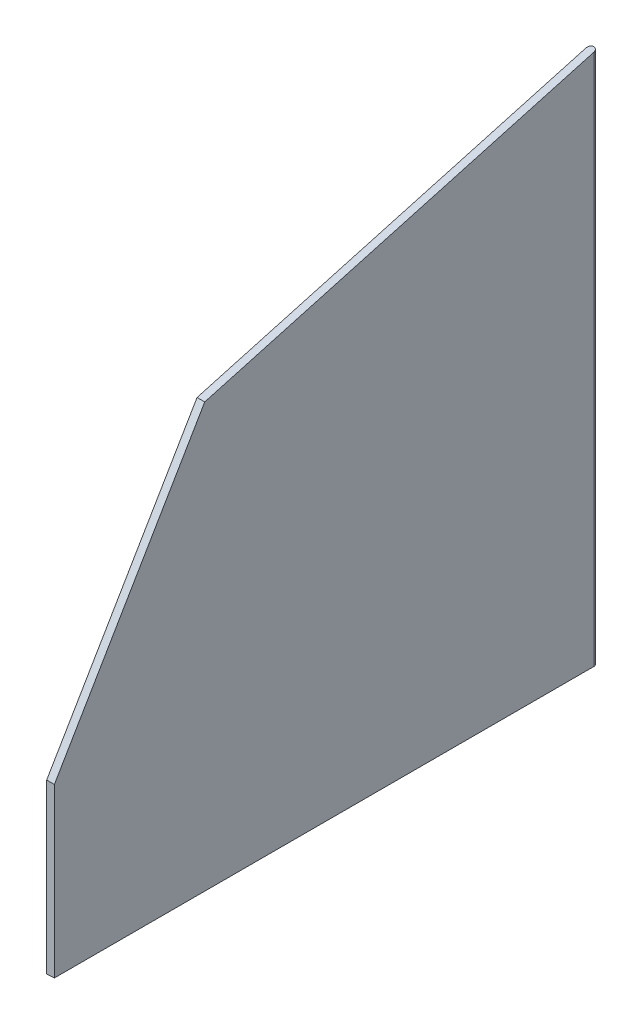
ISO-10303-21;
HEADER;
FILE_DESCRIPTION(('STEP AP214'),'2;1');
FILE_NAME('part.step','',(''),(''),'','','');
FILE_SCHEMA(('AUTOMOTIVE_DESIGN { 1 0 10303 214 1 1 1 1 }'));
ENDSEC;
DATA;
#1=APPLICATION_CONTEXT('core data for automotive mechanical design processes');
#2=APPLICATION_PROTOCOL_DEFINITION('international standard','automotive_design',2000,#1);
#3=PRODUCT_CONTEXT('',#1,'mechanical');
#4=PRODUCT('Part','Part','',(#3));
#5=PRODUCT_RELATED_PRODUCT_CATEGORY('part','',(#4));
#6=PRODUCT_DEFINITION_FORMATION('','',#4);
#7=PRODUCT_DEFINITION_CONTEXT('part definition',#1,'design');
#8=PRODUCT_DEFINITION('design','',#6,#7);
#9=PRODUCT_DEFINITION_SHAPE('','',#8);
#10=(LENGTH_UNIT() NAMED_UNIT(*) SI_UNIT(.MILLI.,.METRE.));
#11=(NAMED_UNIT(*) PLANE_ANGLE_UNIT() SI_UNIT($,.RADIAN.));
#12=(NAMED_UNIT(*) SI_UNIT($,.STERADIAN.) SOLID_ANGLE_UNIT());
#13=UNCERTAINTY_MEASURE_WITH_UNIT(LENGTH_MEASURE(1.E-05),#10,'distance_accuracy_value','');
#14=(GEOMETRIC_REPRESENTATION_CONTEXT(3) GLOBAL_UNCERTAINTY_ASSIGNED_CONTEXT((#13)) GLOBAL_UNIT_ASSIGNED_CONTEXT((#10,
#11,#12)) REPRESENTATION_CONTEXT('',''));
#15=CARTESIAN_POINT('',(0.,0.,0.));
#16=DIRECTION('',(0.,0.,1.));
#17=DIRECTION('',(1.,0.,0.));
#18=AXIS2_PLACEMENT_3D('',#15,#16,#17);
#19=CARTESIAN_POINT('',(20.,-136.254408060453,776.290409850645));
#20=DIRECTION('',(0.,0.,-1.));
#21=DIRECTION('',(0.,1.,0.));
#22=AXIS2_PLACEMENT_3D('',#19,#20,#21);
#23=PLANE('',#22);
#24=DIRECTION('',(-0.997789886117022,-0.0664480485987357,0.));
#25=VECTOR('',#24,1.);
#26=CARTESIAN_POINT('',(48.8853135355899,-569.998879281525,776.290409850645));
#27=LINE('',#26,#25);
#28=CARTESIAN_POINT('',(20.,-571.922503427559,776.290409850645));
#29=VERTEX_POINT('',#28);
#30=CARTESIAN_POINT('',(0.,-573.254408060453,776.290409850645));
#31=VERTEX_POINT('',#30);
#32=EDGE_CURVE('E94',#29,#31,#27,.T.);
#33=ORIENTED_EDGE('',*,*,#32,.F.);
#34=DIRECTION('',(0.,-1.,0.));
#35=VECTOR('',#34,1.);
#36=CARTESIAN_POINT('',(20.,-136.254408060453,776.290409850645));
#37=LINE('',#36,#35);
#38=CARTESIAN_POINT('',(20.,-136.254408060453,776.290409850645));
#39=VERTEX_POINT('',#38);
#40=EDGE_CURVE('E106',#39,#29,#37,.T.);
#41=ORIENTED_EDGE('',*,*,#40,.F.);
#42=DIRECTION('',(-1.,0.,0.));
#43=VECTOR('',#42,1.);
#44=CARTESIAN_POINT('',(20.,-136.254408060453,776.290409850645));
#45=LINE('',#44,#43);
#46=CARTESIAN_POINT('',(0.,-136.254408060453,776.290409850645));
#47=VERTEX_POINT('',#46);
#48=EDGE_CURVE('E113',#39,#47,#45,.T.);
#49=ORIENTED_EDGE('',*,*,#48,.T.);
#50=DIRECTION('',(0.,-1.,0.));
#51=VECTOR('',#50,1.);
#52=CARTESIAN_POINT('',(0.,-136.254408060453,776.290409850645));
#53=LINE('',#52,#51);
#54=EDGE_CURVE('E107',#47,#31,#53,.T.);
#55=ORIENTED_EDGE('',*,*,#54,.T.);
#56=EDGE_LOOP('',(#33,#41,#49,#55));
#57=FACE_BOUND('',#56,.T.);
#58=ADVANCED_FACE('F39',(#57),#23,.F.);
#59=CARTESIAN_POINT('',(20.,0.,0.));
#60=DIRECTION('',(-1.,0.,0.));
#61=DIRECTION('',(0.,0.,1.));
#62=AXIS2_PLACEMENT_3D('',#59,#60,#61);
#63=PLANE('',#62);
#64=DIRECTION('',(0.,0.,-1.));
#65=VECTOR('',#64,1.);
#66=CARTESIAN_POINT('',(20.,-571.922503427559,871.));
#67=LINE('',#66,#65);
#68=CARTESIAN_POINT('',(20.,-571.922503427559,-625.709590149355));
#69=VERTEX_POINT('',#68);
#70=EDGE_CURVE('E93',#29,#69,#67,.T.);
#71=ORIENTED_EDGE('',*,*,#70,.T.);
#72=DIRECTION('',(0.,1.,0.));
#73=VECTOR('',#72,1.);
#74=CARTESIAN_POINT('',(20.,0.,-625.709590149355));
#75=LINE('',#74,#73);
#76=CARTESIAN_POINT('',(20.,810.962210145606,-625.709590149355));
#77=VERTEX_POINT('',#76);
#78=EDGE_CURVE('E131',#69,#77,#75,.T.);
#79=ORIENTED_EDGE('',*,*,#78,.T.);
#80=DIRECTION('',(0.,-0.268145033201166,0.963378555485613));
#81=VECTOR('',#80,1.);
#82=CARTESIAN_POINT('',(20.,813.745591939547,-635.709590149355));
#83=LINE('',#82,#81);
#84=CARTESIAN_POINT('',(20.,529.511856746311,385.471678665395));
#85=VERTEX_POINT('',#84);
#86=EDGE_CURVE('E118',#77,#85,#83,.T.);
#87=ORIENTED_EDGE('',*,*,#86,.T.);
#88=DIRECTION('',(0.,-0.862391534723788,0.506241879773641));
#89=VECTOR('',#88,1.);
#90=CARTESIAN_POINT('',(20.,529.511856746311,385.471678665395));
#91=LINE('',#90,#89);
#92=EDGE_CURVE('E114',#85,#39,#91,.T.);
#93=ORIENTED_EDGE('',*,*,#92,.T.);
#94=ORIENTED_EDGE('',*,*,#40,.T.);
#95=EDGE_LOOP('',(#71,#79,#87,#93,#94));
#96=FACE_BOUND('',#95,.T.);
#97=ADVANCED_FACE('F112',(#96),#63,.F.);
#98=CARTESIAN_POINT('',(20.,813.745591939547,-635.709590149355));
#99=DIRECTION('',(0.,-0.963378555485613,-0.268145033201166));
#100=DIRECTION('',(0.,0.268145033201166,-0.963378555485613));
#101=AXIS2_PLACEMENT_3D('',#98,#99,#100);
#102=PLANE('',#101);
#103=ORIENTED_EDGE('',*,*,#86,.F.);
#104=CARTESIAN_POINT('',(10.,810.962210145606,-625.709590149355));
#105=DIRECTION('',(0.,-0.963378555485613,-0.268145033201166));
#106=DIRECTION('',(0.,0.268145033201166,-0.963378555485613));
#107=AXIS2_PLACEMENT_3D('',#104,#105,#106);
#108=ELLIPSE('',#107,10.3801355584039,10.);
#109=CARTESIAN_POINT('',(10.,813.745591939547,-635.709590149355));
#110=VERTEX_POINT('',#109);
#111=EDGE_CURVE('E134',#77,#110,#108,.F.);
#112=ORIENTED_EDGE('',*,*,#111,.T.);
#113=CARTESIAN_POINT('',(10.,810.962210145606,-625.709590149355));
#114=DIRECTION('',(0.,-0.963378555485613,-0.268145033201166));
#115=DIRECTION('',(0.,-0.268145033201166,0.963378555485613));
#116=AXIS2_PLACEMENT_3D('',#113,#114,#115);
#117=ELLIPSE('',#116,10.3801355584039,10.);
#118=CARTESIAN_POINT('',(0.,810.962210145606,-625.709590149355));
#119=VERTEX_POINT('',#118);
#120=EDGE_CURVE('E132',#110,#119,#117,.F.);
#121=ORIENTED_EDGE('',*,*,#120,.T.);
#122=DIRECTION('',(0.,-0.268145033201166,0.963378555485613));
#123=VECTOR('',#122,1.);
#124=CARTESIAN_POINT('',(0.,813.745591939547,-635.709590149355));
#125=LINE('',#124,#123);
#126=CARTESIAN_POINT('',(0.,529.511856746311,385.471678665395));
#127=VERTEX_POINT('',#126);
#128=EDGE_CURVE('E108',#119,#127,#125,.T.);
#129=ORIENTED_EDGE('',*,*,#128,.T.);
#130=DIRECTION('',(-1.,0.,0.));
#131=VECTOR('',#130,1.);
#132=CARTESIAN_POINT('',(20.,529.511856746311,385.471678665395));
#133=LINE('',#132,#131);
#134=EDGE_CURVE('E120',#85,#127,#133,.T.);
#135=ORIENTED_EDGE('',*,*,#134,.F.);
#136=EDGE_LOOP('',(#103,#112,#121,#129,#135));
#137=FACE_BOUND('',#136,.T.);
#138=ADVANCED_FACE('F143',(#137),#102,.F.);
#139=CARTESIAN_POINT('',(20.,529.511856746311,385.471678665395));
#140=DIRECTION('',(0.,-0.506241879773641,-0.862391534723788));
#141=DIRECTION('',(0.,0.862391534723788,-0.506241879773641));
#142=AXIS2_PLACEMENT_3D('',#139,#140,#141);
#143=PLANE('',#142);
#144=DIRECTION('',(0.,-0.862391534723788,0.506241879773641));
#145=VECTOR('',#144,1.);
#146=CARTESIAN_POINT('',(0.,529.511856746311,385.471678665395));
#147=LINE('',#146,#145);
#148=EDGE_CURVE('E122',#127,#47,#147,.T.);
#149=ORIENTED_EDGE('',*,*,#148,.T.);
#150=ORIENTED_EDGE('',*,*,#48,.F.);
#151=ORIENTED_EDGE('',*,*,#92,.F.);
#152=ORIENTED_EDGE('',*,*,#134,.T.);
#153=EDGE_LOOP('',(#149,#150,#151,#152));
#154=FACE_BOUND('',#153,.T.);
#155=ADVANCED_FACE('F156',(#154),#143,.F.);
#156=CARTESIAN_POINT('',(0.,0.,0.));
#157=DIRECTION('',(-1.,0.,0.));
#158=DIRECTION('',(0.,0.,1.));
#159=AXIS2_PLACEMENT_3D('',#156,#157,#158);
#160=PLANE('',#159);
#161=ORIENTED_EDGE('',*,*,#128,.F.);
#162=DIRECTION('',(0.,1.,0.));
#163=VECTOR('',#162,1.);
#164=CARTESIAN_POINT('',(0.,-573.254408060453,-625.709590149355));
#165=LINE('',#164,#163);
#166=CARTESIAN_POINT('',(0.,-573.254408060453,-625.709590149355));
#167=VERTEX_POINT('',#166);
#168=EDGE_CURVE('E11',#119,#167,#165,.F.);
#169=ORIENTED_EDGE('',*,*,#168,.T.);
#170=DIRECTION('',(0.,0.,-1.));
#171=VECTOR('',#170,1.);
#172=CARTESIAN_POINT('',(0.,-573.254408060453,776.290409850645));
#173=LINE('',#172,#171);
#174=EDGE_CURVE('E130',#31,#167,#173,.T.);
#175=ORIENTED_EDGE('',*,*,#174,.F.);
#176=ORIENTED_EDGE('',*,*,#54,.F.);
#177=ORIENTED_EDGE('',*,*,#148,.F.);
#178=EDGE_LOOP('',(#161,#169,#175,#176,#177));
#179=FACE_BOUND('',#178,.T.);
#180=ADVANCED_FACE('F160',(#179),#160,.T.);
#181=CARTESIAN_POINT('',(20.,-571.922503427559,871.));
#182=DIRECTION('',(0.0664480485987357,-0.997789886117022,0.));
#183=DIRECTION('',(0.997789886117022,0.0664480485987357,0.));
#184=AXIS2_PLACEMENT_3D('',#181,#182,#183);
#185=PLANE('',#184);
#186=CARTESIAN_POINT('',(10.0021453411074,-572.588312874518,-625.709590149355));
#187=DIRECTION('',(0.0664480485987357,-0.997789886117022,0.));
#188=DIRECTION('',(0.997789886117022,0.0664480485987357,0.));
#189=AXIS2_PLACEMENT_3D('',#186,#187,#188);
#190=CIRCLE('',#189,5.);
#191=CARTESIAN_POINT('',(14.9910947716925,-572.256072631524,-625.709590149355));
#192=VERTEX_POINT('',#191);
#193=EDGE_CURVE('E150',#192,#192,#190,.T.);
#194=ORIENTED_EDGE('',*,*,#193,.F.);
#195=EDGE_LOOP('',(#194));
#196=FACE_BOUND('',#195,.T.);
#197=CARTESIAN_POINT('',(10.,-572.588455744006,-625.709590149355));
#198=DIRECTION('',(0.0664480485987357,-0.997789886117022,0.));
#199=DIRECTION('',(-0.997789886117022,-0.0664480485987357,0.));
#200=AXIS2_PLACEMENT_3D('',#197,#198,#199);
#201=ELLIPSE('',#200,10.022150093058,10.);
#202=CARTESIAN_POINT('',(10.,-572.588455744006,-635.709590149355));
#203=VERTEX_POINT('',#202);
#204=EDGE_CURVE('E58',#167,#203,#201,.T.);
#205=ORIENTED_EDGE('',*,*,#204,.T.);
#206=CARTESIAN_POINT('',(10.,-572.588455744006,-625.709590149355));
#207=DIRECTION('',(0.0664480485987357,-0.997789886117022,0.));
#208=DIRECTION('',(0.997789886117022,0.0664480485987357,0.));
#209=AXIS2_PLACEMENT_3D('',#206,#207,#208);
#210=ELLIPSE('',#209,10.022150093058,10.);
#211=EDGE_CURVE('E48',#203,#69,#210,.T.);
#212=ORIENTED_EDGE('',*,*,#211,.T.);
#213=ORIENTED_EDGE('',*,*,#70,.F.);
#214=ORIENTED_EDGE('',*,*,#32,.T.);
#215=ORIENTED_EDGE('',*,*,#174,.T.);
#216=EDGE_LOOP('',(#205,#212,#213,#214,#215));
#217=FACE_BOUND('',#216,.T.);
#218=ADVANCED_FACE('F91',(#196,#217),#185,.T.);
#219=CARTESIAN_POINT('',(8.67318436913269,-552.632515152177,-625.709590149355));
#220=DIRECTION('',(0.0664480485987357,-0.997789886117022,0.));
#221=DIRECTION('',(0.997789886117022,0.0664480485987357,0.));
#222=AXIS2_PLACEMENT_3D('',#219,#220,#221);
#223=CYLINDRICAL_SURFACE('',#222,5.);
#224=CARTESIAN_POINT('',(8.67318436913269,-552.632515152177,-625.709590149355));
#225=DIRECTION('',(0.0664480485987357,-0.997789886117022,0.));
#226=DIRECTION('',(0.997789886117022,0.0664480485987357,0.));
#227=AXIS2_PLACEMENT_3D('',#224,#225,#226);
#228=CIRCLE('',#227,5.);
#229=CARTESIAN_POINT('',(13.6621337997178,-552.300274909184,-625.709590149355));
#230=VERTEX_POINT('',#229);
#231=EDGE_CURVE('E101',#230,#230,#228,.T.);
#232=ORIENTED_EDGE('',*,*,#231,.F.);
#233=EDGE_LOOP('',(#232));
#234=FACE_BOUND('',#233,.T.);
#235=ORIENTED_EDGE('',*,*,#193,.T.);
#236=EDGE_LOOP('',(#235));
#237=FACE_BOUND('',#236,.T.);
#238=ADVANCED_FACE('F163',(#234,#237),#223,.F.);
#239=CARTESIAN_POINT('',(8.67318436913269,-552.632515152177,-625.709590149355));
#240=DIRECTION('',(0.0664480485987357,-0.997789886117022,0.));
#241=DIRECTION('',(0.997789886117022,0.0664480485987357,0.));
#242=AXIS2_PLACEMENT_3D('',#239,#240,#241);
#243=PLANE('',#242);
#244=ORIENTED_EDGE('',*,*,#231,.T.);
#245=EDGE_LOOP('',(#244));
#246=FACE_BOUND('',#245,.T.);
#247=ADVANCED_FACE('F182',(#246),#243,.T.);
#248=CARTESIAN_POINT('',(10.,-573.254408060453,-625.709590149355));
#249=DIRECTION('',(0.,-1.,0.));
#250=DIRECTION('',(0.,0.,-1.));
#251=AXIS2_PLACEMENT_3D('',#248,#249,#250);
#252=CYLINDRICAL_SURFACE('',#251,10.);
#253=DIRECTION('',(0.,1.,0.));
#254=VECTOR('',#253,1.);
#255=CARTESIAN_POINT('',(10.,813.745591939547,-635.709590149355));
#256=LINE('',#255,#254);
#257=EDGE_CURVE('E43',#203,#110,#256,.T.);
#258=ORIENTED_EDGE('',*,*,#257,.F.);
#259=ORIENTED_EDGE('',*,*,#204,.F.);
#260=ORIENTED_EDGE('',*,*,#168,.F.);
#261=ORIENTED_EDGE('',*,*,#120,.F.);
#262=EDGE_LOOP('',(#258,#259,#260,#261));
#263=FACE_BOUND('',#262,.T.);
#264=ADVANCED_FACE('F41',(#263),#252,.T.);
#265=CARTESIAN_POINT('',(10.,0.,-625.709590149355));
#266=DIRECTION('',(0.,1.,0.));
#267=DIRECTION('',(0.,0.,1.));
#268=AXIS2_PLACEMENT_3D('',#265,#266,#267);
#269=CYLINDRICAL_SURFACE('',#268,10.);
#270=ORIENTED_EDGE('',*,*,#211,.F.);
#271=ORIENTED_EDGE('',*,*,#257,.T.);
#272=ORIENTED_EDGE('',*,*,#111,.F.);
#273=ORIENTED_EDGE('',*,*,#78,.F.);
#274=EDGE_LOOP('',(#270,#271,#272,#273));
#275=FACE_BOUND('',#274,.T.);
#276=ADVANCED_FACE('F148',(#275),#269,.T.);
#277=CLOSED_SHELL('',(#58,#97,#138,#155,#180,#218,#238,#247,#264,#276));
#278=MANIFOLD_SOLID_BREP('B2',#277);
#279=ADVANCED_BREP_SHAPE_REPRESENTATION('',(#18,#278),#14);
#280=SHAPE_DEFINITION_REPRESENTATION(#9,#279);
ENDSEC;
END-ISO-10303-21;
